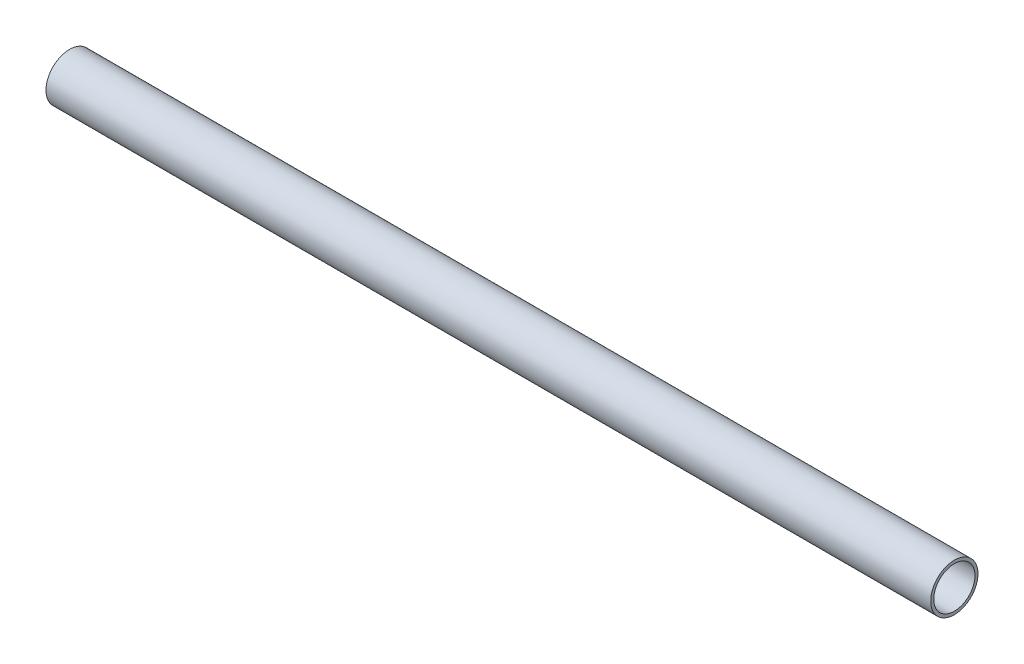
ISO-10303-21;
HEADER;
FILE_DESCRIPTION(('STEP AP214'),'2;1');
FILE_NAME('part.step','',(''),(''),'','','');
FILE_SCHEMA(('AUTOMOTIVE_DESIGN { 1 0 10303 214 1 1 1 1 }'));
ENDSEC;
DATA;
#1=APPLICATION_CONTEXT('core data for automotive mechanical design processes');
#2=APPLICATION_PROTOCOL_DEFINITION('international standard','automotive_design',2000,#1);
#3=PRODUCT_CONTEXT('',#1,'mechanical');
#4=PRODUCT('Part','Part','',(#3));
#5=PRODUCT_RELATED_PRODUCT_CATEGORY('part','',(#4));
#6=PRODUCT_DEFINITION_FORMATION('','',#4);
#7=PRODUCT_DEFINITION_CONTEXT('part definition',#1,'design');
#8=PRODUCT_DEFINITION('design','',#6,#7);
#9=PRODUCT_DEFINITION_SHAPE('','',#8);
#10=(LENGTH_UNIT() NAMED_UNIT(*) SI_UNIT(.MILLI.,.METRE.));
#11=(NAMED_UNIT(*) PLANE_ANGLE_UNIT() SI_UNIT($,.RADIAN.));
#12=(NAMED_UNIT(*) SI_UNIT($,.STERADIAN.) SOLID_ANGLE_UNIT());
#13=UNCERTAINTY_MEASURE_WITH_UNIT(LENGTH_MEASURE(1.E-05),#10,'distance_accuracy_value','');
#14=(GEOMETRIC_REPRESENTATION_CONTEXT(3) GLOBAL_UNCERTAINTY_ASSIGNED_CONTEXT((#13)) GLOBAL_UNIT_ASSIGNED_CONTEXT((#10,
#11,#12)) REPRESENTATION_CONTEXT('',''));
#15=CARTESIAN_POINT('',(0.,0.,0.));
#16=DIRECTION('',(0.,0.,1.));
#17=DIRECTION('',(1.,0.,0.));
#18=AXIS2_PLACEMENT_3D('',#15,#16,#17);
#19=CARTESIAN_POINT('',(290.,0.,0.));
#20=DIRECTION('',(1.,0.,0.));
#21=DIRECTION('',(0.,0.,-1.));
#22=AXIS2_PLACEMENT_3D('',#19,#20,#21);
#23=PLANE('',#22);
#24=CARTESIAN_POINT('',(290.,0.,0.));
#25=DIRECTION('',(1.,0.,0.));
#26=DIRECTION('',(0.,0.,-1.));
#27=AXIS2_PLACEMENT_3D('',#24,#25,#26);
#28=CIRCLE('',#27,7.75);
#29=CARTESIAN_POINT('',(290.,0.,-7.75));
#30=VERTEX_POINT('',#29);
#31=EDGE_CURVE('E10',#30,#30,#28,.T.);
#32=ORIENTED_EDGE('',*,*,#31,.T.);
#33=EDGE_LOOP('',(#32));
#34=FACE_BOUND('',#33,.T.);
#35=CARTESIAN_POINT('',(290.,0.,0.));
#36=DIRECTION('',(1.,0.,0.));
#37=DIRECTION('',(0.,0.,-1.));
#38=AXIS2_PLACEMENT_3D('',#35,#36,#37);
#39=CIRCLE('',#38,6.75);
#40=CARTESIAN_POINT('',(290.,0.,-6.75));
#41=VERTEX_POINT('',#40);
#42=EDGE_CURVE('E42',#41,#41,#39,.T.);
#43=ORIENTED_EDGE('',*,*,#42,.F.);
#44=EDGE_LOOP('',(#43));
#45=FACE_BOUND('',#44,.T.);
#46=ADVANCED_FACE('F31',(#34,#45),#23,.T.);
#47=CARTESIAN_POINT('',(0.,0.,0.));
#48=DIRECTION('',(1.,0.,0.));
#49=DIRECTION('',(0.,0.,-1.));
#50=AXIS2_PLACEMENT_3D('',#47,#48,#49);
#51=PLANE('',#50);
#52=CARTESIAN_POINT('',(0.,0.,0.));
#53=DIRECTION('',(1.,0.,0.));
#54=DIRECTION('',(0.,0.,-1.));
#55=AXIS2_PLACEMENT_3D('',#52,#53,#54);
#56=CIRCLE('',#55,7.75);
#57=CARTESIAN_POINT('',(0.,0.,-7.75));
#58=VERTEX_POINT('',#57);
#59=EDGE_CURVE('E35',#58,#58,#56,.T.);
#60=ORIENTED_EDGE('',*,*,#59,.F.);
#61=EDGE_LOOP('',(#60));
#62=FACE_BOUND('',#61,.T.);
#63=CARTESIAN_POINT('',(0.,0.,0.));
#64=DIRECTION('',(1.,0.,0.));
#65=DIRECTION('',(0.,0.,-1.));
#66=AXIS2_PLACEMENT_3D('',#63,#64,#65);
#67=CIRCLE('',#66,6.75);
#68=CARTESIAN_POINT('',(0.,0.,-6.75));
#69=VERTEX_POINT('',#68);
#70=EDGE_CURVE('E44',#69,#69,#67,.T.);
#71=ORIENTED_EDGE('',*,*,#70,.T.);
#72=EDGE_LOOP('',(#71));
#73=FACE_BOUND('',#72,.T.);
#74=ADVANCED_FACE('F54',(#62,#73),#51,.F.);
#75=CARTESIAN_POINT('',(290.,0.,0.));
#76=DIRECTION('',(-1.,0.,0.));
#77=DIRECTION('',(0.,0.,1.));
#78=AXIS2_PLACEMENT_3D('',#75,#76,#77);
#79=CYLINDRICAL_SURFACE('',#78,7.75);
#80=ORIENTED_EDGE('',*,*,#31,.F.);
#81=EDGE_LOOP('',(#80));
#82=FACE_BOUND('',#81,.T.);
#83=ORIENTED_EDGE('',*,*,#59,.T.);
#84=EDGE_LOOP('',(#83));
#85=FACE_BOUND('',#84,.T.);
#86=ADVANCED_FACE('F33',(#82,#85),#79,.T.);
#87=CARTESIAN_POINT('',(290.,0.,0.));
#88=DIRECTION('',(-1.,0.,0.));
#89=DIRECTION('',(0.,0.,1.));
#90=AXIS2_PLACEMENT_3D('',#87,#88,#89);
#91=CYLINDRICAL_SURFACE('',#90,6.75);
#92=ORIENTED_EDGE('',*,*,#42,.T.);
#93=EDGE_LOOP('',(#92));
#94=FACE_BOUND('',#93,.T.);
#95=ORIENTED_EDGE('',*,*,#70,.F.);
#96=EDGE_LOOP('',(#95));
#97=FACE_BOUND('',#96,.T.);
#98=ADVANCED_FACE('F50',(#94,#97),#91,.F.);
#99=CLOSED_SHELL('',(#46,#74,#86,#98));
#100=MANIFOLD_SOLID_BREP('B2',#99);
#101=ADVANCED_BREP_SHAPE_REPRESENTATION('',(#18,#100),#14);
#102=SHAPE_DEFINITION_REPRESENTATION(#9,#101);
ENDSEC;
END-ISO-10303-21;
